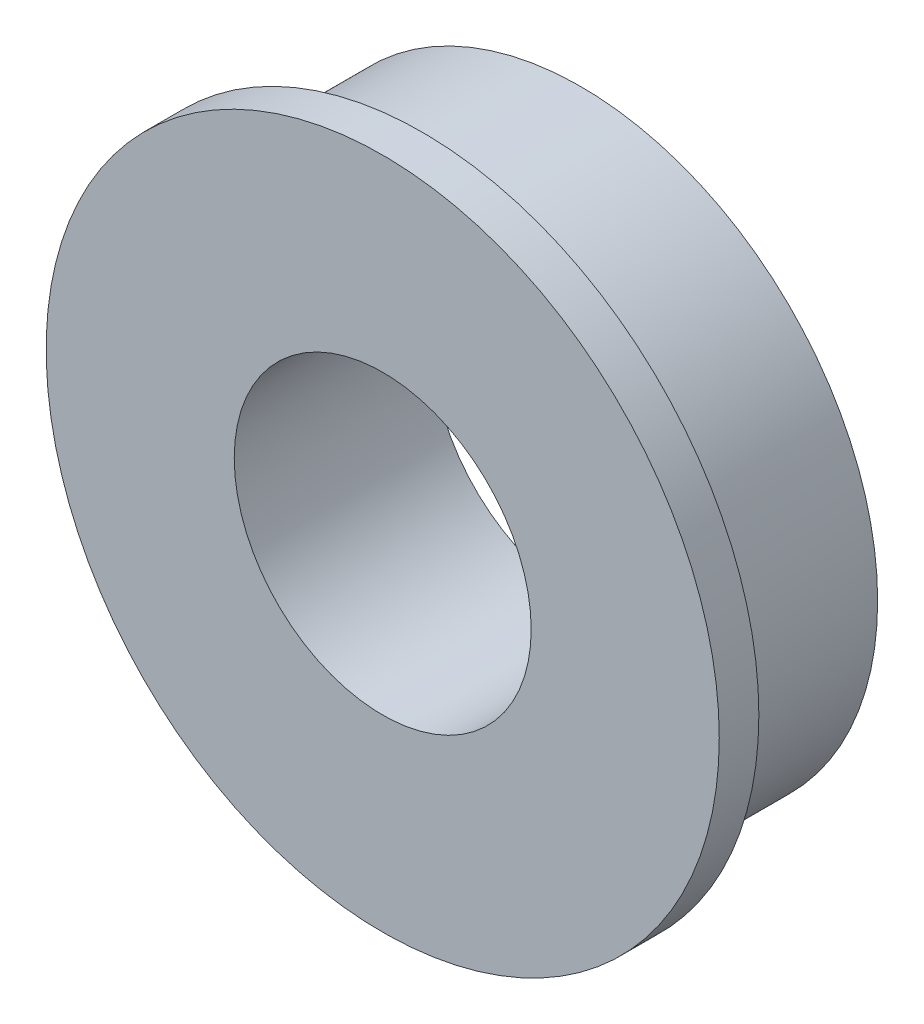
ISO-10303-21;
HEADER;
FILE_DESCRIPTION(('STEP AP214'),'2;1');
FILE_NAME('part.step','',(''),(''),'','','');
FILE_SCHEMA(('AUTOMOTIVE_DESIGN { 1 0 10303 214 1 1 1 1 }'));
ENDSEC;
DATA;
#1=APPLICATION_CONTEXT('core data for automotive mechanical design processes');
#2=APPLICATION_PROTOCOL_DEFINITION('international standard','automotive_design',2000,#1);
#3=PRODUCT_CONTEXT('',#1,'mechanical');
#4=PRODUCT('Part','Part','',(#3));
#5=PRODUCT_RELATED_PRODUCT_CATEGORY('part','',(#4));
#6=PRODUCT_DEFINITION_FORMATION('','',#4);
#7=PRODUCT_DEFINITION_CONTEXT('part definition',#1,'design');
#8=PRODUCT_DEFINITION('design','',#6,#7);
#9=PRODUCT_DEFINITION_SHAPE('','',#8);
#10=(LENGTH_UNIT() NAMED_UNIT(*) SI_UNIT(.MILLI.,.METRE.));
#11=(NAMED_UNIT(*) PLANE_ANGLE_UNIT() SI_UNIT($,.RADIAN.));
#12=(NAMED_UNIT(*) SI_UNIT($,.STERADIAN.) SOLID_ANGLE_UNIT());
#13=UNCERTAINTY_MEASURE_WITH_UNIT(LENGTH_MEASURE(1.E-05),#10,'distance_accuracy_value','');
#14=(GEOMETRIC_REPRESENTATION_CONTEXT(3) GLOBAL_UNCERTAINTY_ASSIGNED_CONTEXT((#13)) GLOBAL_UNIT_ASSIGNED_CONTEXT((#10,
#11,#12)) REPRESENTATION_CONTEXT('',''));
#15=CARTESIAN_POINT('',(0.,0.,0.));
#16=DIRECTION('',(0.,0.,1.));
#17=DIRECTION('',(1.,0.,0.));
#18=AXIS2_PLACEMENT_3D('',#15,#16,#17);
#19=CARTESIAN_POINT('',(0.,0.,0.));
#20=DIRECTION('',(0.,0.,1.));
#21=DIRECTION('',(1.,0.,0.));
#22=AXIS2_PLACEMENT_3D('',#19,#20,#21);
#23=PLANE('',#22);
#24=CARTESIAN_POINT('',(0.,0.,0.));
#25=DIRECTION('',(0.,0.,1.));
#26=DIRECTION('',(1.,0.,0.));
#27=AXIS2_PLACEMENT_3D('',#24,#25,#26);
#28=CIRCLE('',#27,6.);
#29=CARTESIAN_POINT('',(6.,0.,0.));
#30=VERTEX_POINT('',#29);
#31=EDGE_CURVE('E45',#30,#30,#28,.T.);
#32=ORIENTED_EDGE('',*,*,#31,.F.);
#33=EDGE_LOOP('',(#32));
#34=FACE_BOUND('',#33,.T.);
#35=CARTESIAN_POINT('',(0.,0.,0.));
#36=DIRECTION('',(0.,0.,1.));
#37=DIRECTION('',(1.,0.,0.));
#38=AXIS2_PLACEMENT_3D('',#35,#36,#37);
#39=CIRCLE('',#38,3.);
#40=CARTESIAN_POINT('',(3.,0.,0.));
#41=VERTEX_POINT('',#40);
#42=EDGE_CURVE('E52',#41,#41,#39,.T.);
#43=ORIENTED_EDGE('',*,*,#42,.T.);
#44=EDGE_LOOP('',(#43));
#45=FACE_BOUND('',#44,.T.);
#46=ADVANCED_FACE('F41',(#34,#45),#23,.F.);
#47=CARTESIAN_POINT('',(0.,0.,3.2));
#48=DIRECTION('',(0.,0.,-1.));
#49=DIRECTION('',(-1.,0.,0.));
#50=AXIS2_PLACEMENT_3D('',#47,#48,#49);
#51=CYLINDRICAL_SURFACE('',#50,6.);
#52=CARTESIAN_POINT('',(0.,0.,3.2));
#53=DIRECTION('',(0.,0.,1.));
#54=DIRECTION('',(1.,0.,0.));
#55=AXIS2_PLACEMENT_3D('',#52,#53,#54);
#56=CIRCLE('',#55,6.);
#57=CARTESIAN_POINT('',(6.,0.,3.2));
#58=VERTEX_POINT('',#57);
#59=EDGE_CURVE('E10',#58,#58,#56,.T.);
#60=ORIENTED_EDGE('',*,*,#59,.F.);
#61=EDGE_LOOP('',(#60));
#62=FACE_BOUND('',#61,.T.);
#63=ORIENTED_EDGE('',*,*,#31,.T.);
#64=EDGE_LOOP('',(#63));
#65=FACE_BOUND('',#64,.T.);
#66=ADVANCED_FACE('F43',(#62,#65),#51,.T.);
#67=CARTESIAN_POINT('',(0.,0.,3.2));
#68=DIRECTION('',(0.,0.,-1.));
#69=DIRECTION('',(-1.,0.,0.));
#70=AXIS2_PLACEMENT_3D('',#67,#68,#69);
#71=CYLINDRICAL_SURFACE('',#70,3.);
#72=ORIENTED_EDGE('',*,*,#42,.F.);
#73=EDGE_LOOP('',(#72));
#74=FACE_BOUND('',#73,.T.);
#75=CARTESIAN_POINT('',(0.,0.,4.));
#76=DIRECTION('',(0.,0.,1.));
#77=DIRECTION('',(1.,0.,0.));
#78=AXIS2_PLACEMENT_3D('',#75,#76,#77);
#79=CIRCLE('',#78,3.);
#80=CARTESIAN_POINT('',(3.,0.,4.));
#81=VERTEX_POINT('',#80);
#82=EDGE_CURVE('E60',#81,#81,#79,.T.);
#83=ORIENTED_EDGE('',*,*,#82,.T.);
#84=EDGE_LOOP('',(#83));
#85=FACE_BOUND('',#84,.T.);
#86=ADVANCED_FACE('F66',(#74,#85),#71,.F.);
#87=CARTESIAN_POINT('',(0.,0.,4.));
#88=DIRECTION('',(0.,0.,1.));
#89=DIRECTION('',(1.,0.,0.));
#90=AXIS2_PLACEMENT_3D('',#87,#88,#89);
#91=PLANE('',#90);
#92=CARTESIAN_POINT('',(0.,0.,4.));
#93=DIRECTION('',(0.,0.,1.));
#94=DIRECTION('',(1.,0.,0.));
#95=AXIS2_PLACEMENT_3D('',#92,#93,#94);
#96=CIRCLE('',#95,6.8);
#97=CARTESIAN_POINT('',(6.8,0.,4.));
#98=VERTEX_POINT('',#97);
#99=EDGE_CURVE('E56',#98,#98,#96,.T.);
#100=ORIENTED_EDGE('',*,*,#99,.T.);
#101=EDGE_LOOP('',(#100));
#102=FACE_BOUND('',#101,.T.);
#103=ORIENTED_EDGE('',*,*,#82,.F.);
#104=EDGE_LOOP('',(#103));
#105=FACE_BOUND('',#104,.T.);
#106=ADVANCED_FACE('F68',(#102,#105),#91,.T.);
#107=CARTESIAN_POINT('',(0.,0.,3.2));
#108=DIRECTION('',(0.,0.,1.));
#109=DIRECTION('',(1.,0.,0.));
#110=AXIS2_PLACEMENT_3D('',#107,#108,#109);
#111=PLANE('',#110);
#112=ORIENTED_EDGE('',*,*,#59,.T.);
#113=EDGE_LOOP('',(#112));
#114=FACE_BOUND('',#113,.T.);
#115=CARTESIAN_POINT('',(0.,0.,3.2));
#116=DIRECTION('',(0.,0.,1.));
#117=DIRECTION('',(1.,0.,0.));
#118=AXIS2_PLACEMENT_3D('',#115,#116,#117);
#119=CIRCLE('',#118,6.8);
#120=CARTESIAN_POINT('',(6.8,0.,3.2));
#121=VERTEX_POINT('',#120);
#122=EDGE_CURVE('E57',#121,#121,#119,.T.);
#123=ORIENTED_EDGE('',*,*,#122,.F.);
#124=EDGE_LOOP('',(#123));
#125=FACE_BOUND('',#124,.T.);
#126=ADVANCED_FACE('F70',(#114,#125),#111,.F.);
#127=CARTESIAN_POINT('',(0.,0.,4.));
#128=DIRECTION('',(0.,0.,-1.));
#129=DIRECTION('',(-1.,0.,0.));
#130=AXIS2_PLACEMENT_3D('',#127,#128,#129);
#131=CYLINDRICAL_SURFACE('',#130,6.8);
#132=ORIENTED_EDGE('',*,*,#99,.F.);
#133=EDGE_LOOP('',(#132));
#134=FACE_BOUND('',#133,.T.);
#135=ORIENTED_EDGE('',*,*,#122,.T.);
#136=EDGE_LOOP('',(#135));
#137=FACE_BOUND('',#136,.T.);
#138=ADVANCED_FACE('F77',(#134,#137),#131,.T.);
#139=CLOSED_SHELL('',(#46,#66,#86,#106,#126,#138));
#140=MANIFOLD_SOLID_BREP('B2',#139);
#141=ADVANCED_BREP_SHAPE_REPRESENTATION('',(#18,#140),#14);
#142=SHAPE_DEFINITION_REPRESENTATION(#9,#141);
ENDSEC;
END-ISO-10303-21;
